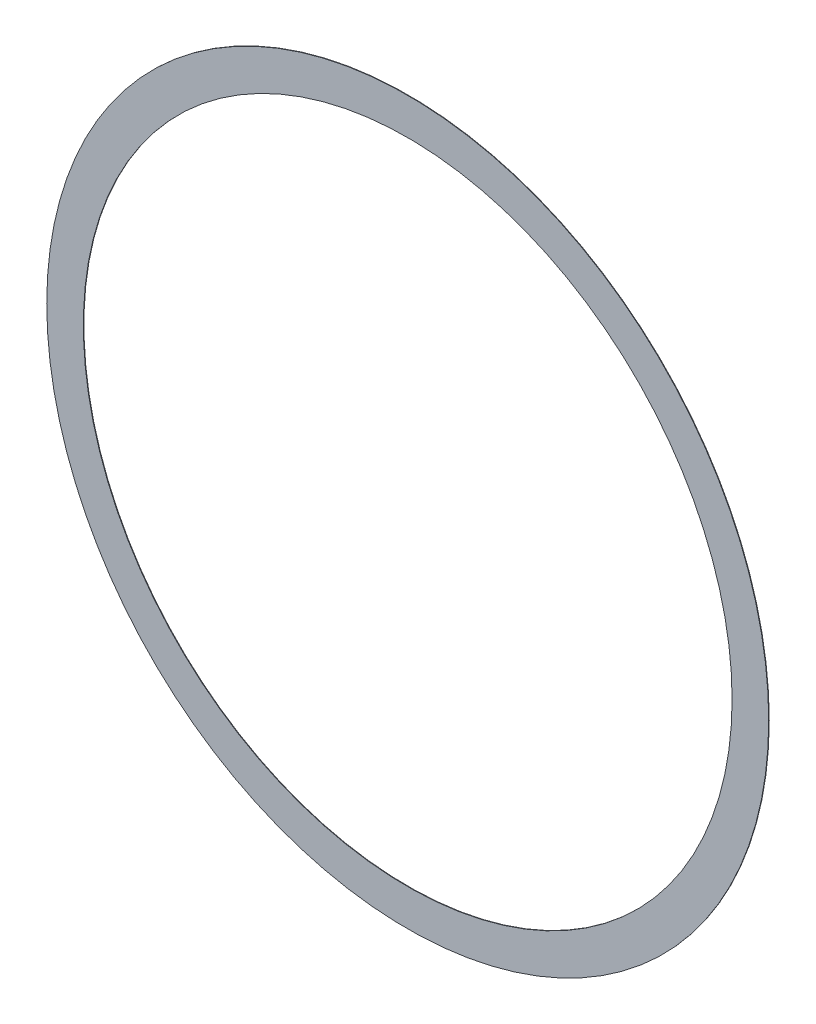
ISO-10303-21;
HEADER;
FILE_DESCRIPTION(('STEP AP214'),'2;1');
FILE_NAME('part.step','',(''),(''),'','','');
FILE_SCHEMA(('AUTOMOTIVE_DESIGN { 1 0 10303 214 1 1 1 1 }'));
ENDSEC;
DATA;
#1=APPLICATION_CONTEXT('core data for automotive mechanical design processes');
#2=APPLICATION_PROTOCOL_DEFINITION('international standard','automotive_design',2000,#1);
#3=PRODUCT_CONTEXT('',#1,'mechanical');
#4=PRODUCT('Part','Part','',(#3));
#5=PRODUCT_RELATED_PRODUCT_CATEGORY('part','',(#4));
#6=PRODUCT_DEFINITION_FORMATION('','',#4);
#7=PRODUCT_DEFINITION_CONTEXT('part definition',#1,'design');
#8=PRODUCT_DEFINITION('design','',#6,#7);
#9=PRODUCT_DEFINITION_SHAPE('','',#8);
#10=(LENGTH_UNIT() NAMED_UNIT(*) SI_UNIT(.MILLI.,.METRE.));
#11=(NAMED_UNIT(*) PLANE_ANGLE_UNIT() SI_UNIT($,.RADIAN.));
#12=(NAMED_UNIT(*) SI_UNIT($,.STERADIAN.) SOLID_ANGLE_UNIT());
#13=UNCERTAINTY_MEASURE_WITH_UNIT(LENGTH_MEASURE(1.E-05),#10,'distance_accuracy_value','');
#14=(GEOMETRIC_REPRESENTATION_CONTEXT(3) GLOBAL_UNCERTAINTY_ASSIGNED_CONTEXT((#13)) GLOBAL_UNIT_ASSIGNED_CONTEXT((#10,
#11,#12)) REPRESENTATION_CONTEXT('',''));
#15=CARTESIAN_POINT('',(0.,0.,0.));
#16=DIRECTION('',(0.,0.,1.));
#17=DIRECTION('',(1.,0.,0.));
#18=AXIS2_PLACEMENT_3D('',#15,#16,#17);
#19=CARTESIAN_POINT('',(0.,0.,0.1));
#20=DIRECTION('',(0.,0.,1.));
#21=DIRECTION('',(1.,0.,0.));
#22=AXIS2_PLACEMENT_3D('',#19,#20,#21);
#23=PLANE('',#22);
#24=CARTESIAN_POINT('',(0.,0.,0.1));
#25=DIRECTION('',(0.,0.,1.));
#26=DIRECTION('',(1.,0.,0.));
#27=AXIS2_PLACEMENT_3D('',#24,#25,#26);
#28=CIRCLE('',#27,69.);
#29=CARTESIAN_POINT('',(69.,0.,0.1));
#30=VERTEX_POINT('',#29);
#31=EDGE_CURVE('E10',#30,#30,#28,.T.);
#32=ORIENTED_EDGE('',*,*,#31,.T.);
#33=EDGE_LOOP('',(#32));
#34=FACE_BOUND('',#33,.T.);
#35=CARTESIAN_POINT('',(0.,0.,0.1));
#36=DIRECTION('',(0.,0.,1.));
#37=DIRECTION('',(1.,0.,0.));
#38=AXIS2_PLACEMENT_3D('',#35,#36,#37);
#39=CIRCLE('',#38,62.);
#40=CARTESIAN_POINT('',(62.,0.,0.1));
#41=VERTEX_POINT('',#40);
#42=EDGE_CURVE('E50',#41,#41,#39,.T.);
#43=ORIENTED_EDGE('',*,*,#42,.F.);
#44=EDGE_LOOP('',(#43));
#45=FACE_BOUND('',#44,.T.);
#46=ADVANCED_FACE('F39',(#34,#45),#23,.T.);
#47=CARTESIAN_POINT('',(0.,0.,0.));
#48=DIRECTION('',(0.,0.,1.));
#49=DIRECTION('',(1.,0.,0.));
#50=AXIS2_PLACEMENT_3D('',#47,#48,#49);
#51=PLANE('',#50);
#52=CARTESIAN_POINT('',(0.,0.,0.));
#53=DIRECTION('',(0.,0.,1.));
#54=DIRECTION('',(1.,0.,0.));
#55=AXIS2_PLACEMENT_3D('',#52,#53,#54);
#56=CIRCLE('',#55,69.);
#57=CARTESIAN_POINT('',(69.,0.,0.));
#58=VERTEX_POINT('',#57);
#59=EDGE_CURVE('E43',#58,#58,#56,.T.);
#60=ORIENTED_EDGE('',*,*,#59,.F.);
#61=EDGE_LOOP('',(#60));
#62=FACE_BOUND('',#61,.T.);
#63=CARTESIAN_POINT('',(0.,0.,0.));
#64=DIRECTION('',(0.,0.,1.));
#65=DIRECTION('',(1.,0.,0.));
#66=AXIS2_PLACEMENT_3D('',#63,#64,#65);
#67=CIRCLE('',#66,62.);
#68=CARTESIAN_POINT('',(62.,0.,0.));
#69=VERTEX_POINT('',#68);
#70=EDGE_CURVE('E52',#69,#69,#67,.T.);
#71=ORIENTED_EDGE('',*,*,#70,.T.);
#72=EDGE_LOOP('',(#71));
#73=FACE_BOUND('',#72,.T.);
#74=ADVANCED_FACE('F62',(#62,#73),#51,.F.);
#75=CARTESIAN_POINT('',(0.,0.,0.1));
#76=DIRECTION('',(0.,0.,-1.));
#77=DIRECTION('',(-1.,0.,0.));
#78=AXIS2_PLACEMENT_3D('',#75,#76,#77);
#79=CYLINDRICAL_SURFACE('',#78,69.);
#80=ORIENTED_EDGE('',*,*,#31,.F.);
#81=EDGE_LOOP('',(#80));
#82=FACE_BOUND('',#81,.T.);
#83=ORIENTED_EDGE('',*,*,#59,.T.);
#84=EDGE_LOOP('',(#83));
#85=FACE_BOUND('',#84,.T.);
#86=ADVANCED_FACE('F41',(#82,#85),#79,.T.);
#87=CARTESIAN_POINT('',(0.,0.,0.1));
#88=DIRECTION('',(0.,0.,-1.));
#89=DIRECTION('',(-1.,0.,0.));
#90=AXIS2_PLACEMENT_3D('',#87,#88,#89);
#91=CYLINDRICAL_SURFACE('',#90,62.);
#92=ORIENTED_EDGE('',*,*,#42,.T.);
#93=EDGE_LOOP('',(#92));
#94=FACE_BOUND('',#93,.T.);
#95=ORIENTED_EDGE('',*,*,#70,.F.);
#96=EDGE_LOOP('',(#95));
#97=FACE_BOUND('',#96,.T.);
#98=ADVANCED_FACE('F58',(#94,#97),#91,.F.);
#99=CLOSED_SHELL('',(#46,#74,#86,#98));
#100=MANIFOLD_SOLID_BREP('B2',#99);
#101=ADVANCED_BREP_SHAPE_REPRESENTATION('',(#18,#100),#14);
#102=SHAPE_DEFINITION_REPRESENTATION(#9,#101);
ENDSEC;
END-ISO-10303-21;
